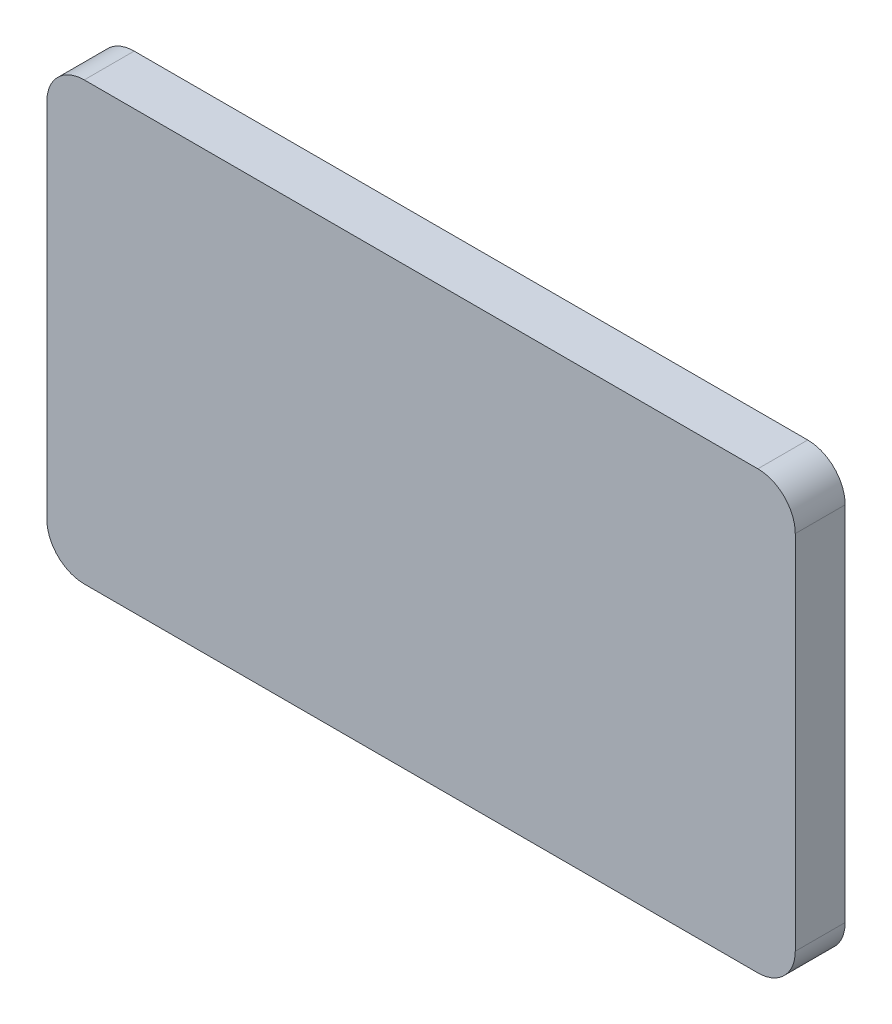
ISO-10303-21;
HEADER;
FILE_DESCRIPTION(('STEP AP214'),'2;1');
FILE_NAME('part.step','',(''),(''),'','','');
FILE_SCHEMA(('AUTOMOTIVE_DESIGN { 1 0 10303 214 1 1 1 1 }'));
ENDSEC;
DATA;
#1=APPLICATION_CONTEXT('core data for automotive mechanical design processes');
#2=APPLICATION_PROTOCOL_DEFINITION('international standard','automotive_design',2000,#1);
#3=PRODUCT_CONTEXT('',#1,'mechanical');
#4=PRODUCT('Part','Part','',(#3));
#5=PRODUCT_RELATED_PRODUCT_CATEGORY('part','',(#4));
#6=PRODUCT_DEFINITION_FORMATION('','',#4);
#7=PRODUCT_DEFINITION_CONTEXT('part definition',#1,'design');
#8=PRODUCT_DEFINITION('design','',#6,#7);
#9=PRODUCT_DEFINITION_SHAPE('','',#8);
#10=(LENGTH_UNIT() NAMED_UNIT(*) SI_UNIT(.MILLI.,.METRE.));
#11=(NAMED_UNIT(*) PLANE_ANGLE_UNIT() SI_UNIT($,.RADIAN.));
#12=(NAMED_UNIT(*) SI_UNIT($,.STERADIAN.) SOLID_ANGLE_UNIT());
#13=UNCERTAINTY_MEASURE_WITH_UNIT(LENGTH_MEASURE(1.E-05),#10,'distance_accuracy_value','');
#14=(GEOMETRIC_REPRESENTATION_CONTEXT(3) GLOBAL_UNCERTAINTY_ASSIGNED_CONTEXT((#13)) GLOBAL_UNIT_ASSIGNED_CONTEXT((#10,
#11,#12)) REPRESENTATION_CONTEXT('',''));
#15=CARTESIAN_POINT('',(0.,0.,0.));
#16=DIRECTION('',(0.,0.,1.));
#17=DIRECTION('',(1.,0.,0.));
#18=AXIS2_PLACEMENT_3D('',#15,#16,#17);
#19=CARTESIAN_POINT('',(0.,0.,12.7));
#20=DIRECTION('',(1.,0.,0.));
#21=DIRECTION('',(0.,0.,-1.));
#22=AXIS2_PLACEMENT_3D('',#19,#20,#21);
#23=PLANE('',#22);
#24=DIRECTION('',(0.,-1.,0.));
#25=VECTOR('',#24,1.);
#26=CARTESIAN_POINT('',(0.,0.,0.));
#27=LINE('',#26,#25);
#28=CARTESIAN_POINT('',(0.,101.6,0.));
#29=VERTEX_POINT('',#28);
#30=CARTESIAN_POINT('',(0.,9.525,0.));
#31=VERTEX_POINT('',#30);
#32=EDGE_CURVE('E125',#29,#31,#27,.T.);
#33=ORIENTED_EDGE('',*,*,#32,.T.);
#34=DIRECTION('',(0.,0.,-1.));
#35=VECTOR('',#34,1.);
#36=CARTESIAN_POINT('',(0.,9.525,12.7));
#37=LINE('',#36,#35);
#38=CARTESIAN_POINT('',(0.,9.525,12.7));
#39=VERTEX_POINT('',#38);
#40=EDGE_CURVE('E103',#31,#39,#37,.F.);
#41=ORIENTED_EDGE('',*,*,#40,.T.);
#42=DIRECTION('',(0.,-1.,0.));
#43=VECTOR('',#42,1.);
#44=CARTESIAN_POINT('',(0.,0.,12.7));
#45=LINE('',#44,#43);
#46=CARTESIAN_POINT('',(0.,101.6,12.7));
#47=VERTEX_POINT('',#46);
#48=EDGE_CURVE('E134',#47,#39,#45,.T.);
#49=ORIENTED_EDGE('',*,*,#48,.F.);
#50=DIRECTION('',(0.,0.,-1.));
#51=VECTOR('',#50,1.);
#52=CARTESIAN_POINT('',(0.,101.6,12.7));
#53=LINE('',#52,#51);
#54=EDGE_CURVE('E108',#47,#29,#53,.T.);
#55=ORIENTED_EDGE('',*,*,#54,.T.);
#56=EDGE_LOOP('',(#33,#41,#49,#55));
#57=FACE_BOUND('',#56,.T.);
#58=ADVANCED_FACE('F32',(#57),#23,.F.);
#59=CARTESIAN_POINT('',(0.,0.,12.7));
#60=DIRECTION('',(0.,1.,0.));
#61=DIRECTION('',(0.,0.,1.));
#62=AXIS2_PLACEMENT_3D('',#59,#60,#61);
#63=PLANE('',#62);
#64=DIRECTION('',(1.,0.,0.));
#65=VECTOR('',#64,1.);
#66=CARTESIAN_POINT('',(0.,0.,12.7));
#67=LINE('',#66,#65);
#68=CARTESIAN_POINT('',(9.525,0.,12.7));
#69=VERTEX_POINT('',#68);
#70=CARTESIAN_POINT('',(180.975,0.,12.7));
#71=VERTEX_POINT('',#70);
#72=EDGE_CURVE('E118',#69,#71,#67,.T.);
#73=ORIENTED_EDGE('',*,*,#72,.F.);
#74=DIRECTION('',(0.,0.,-1.));
#75=VECTOR('',#74,1.);
#76=CARTESIAN_POINT('',(9.525,0.,12.7));
#77=LINE('',#76,#75);
#78=CARTESIAN_POINT('',(9.525,0.,0.));
#79=VERTEX_POINT('',#78);
#80=EDGE_CURVE('E102',#69,#79,#77,.T.);
#81=ORIENTED_EDGE('',*,*,#80,.T.);
#82=DIRECTION('',(1.,0.,0.));
#83=VECTOR('',#82,1.);
#84=CARTESIAN_POINT('',(0.,0.,0.));
#85=LINE('',#84,#83);
#86=CARTESIAN_POINT('',(180.975,0.,0.));
#87=VERTEX_POINT('',#86);
#88=EDGE_CURVE('E115',#79,#87,#85,.T.);
#89=ORIENTED_EDGE('',*,*,#88,.T.);
#90=DIRECTION('',(0.,0.,-1.));
#91=VECTOR('',#90,1.);
#92=CARTESIAN_POINT('',(180.975,0.,12.7));
#93=LINE('',#92,#91);
#94=EDGE_CURVE('E120',#87,#71,#93,.F.);
#95=ORIENTED_EDGE('',*,*,#94,.T.);
#96=EDGE_LOOP('',(#73,#81,#89,#95));
#97=FACE_BOUND('',#96,.T.);
#98=ADVANCED_FACE('F114',(#97),#63,.F.);
#99=CARTESIAN_POINT('',(190.5,0.,12.7));
#100=DIRECTION('',(-1.,0.,0.));
#101=DIRECTION('',(0.,0.,1.));
#102=AXIS2_PLACEMENT_3D('',#99,#100,#101);
#103=PLANE('',#102);
#104=DIRECTION('',(0.,1.,0.));
#105=VECTOR('',#104,1.);
#106=CARTESIAN_POINT('',(190.5,0.,12.7));
#107=LINE('',#106,#105);
#108=CARTESIAN_POINT('',(190.5,9.525,12.7));
#109=VERTEX_POINT('',#108);
#110=CARTESIAN_POINT('',(190.5,101.6,12.7));
#111=VERTEX_POINT('',#110);
#112=EDGE_CURVE('E160',#109,#111,#107,.T.);
#113=ORIENTED_EDGE('',*,*,#112,.F.);
#114=DIRECTION('',(0.,0.,-1.));
#115=VECTOR('',#114,1.);
#116=CARTESIAN_POINT('',(190.5,9.525,12.7));
#117=LINE('',#116,#115);
#118=CARTESIAN_POINT('',(190.5,9.525,0.));
#119=VERTEX_POINT('',#118);
#120=EDGE_CURVE('E153',#109,#119,#117,.T.);
#121=ORIENTED_EDGE('',*,*,#120,.T.);
#122=DIRECTION('',(0.,1.,0.));
#123=VECTOR('',#122,1.);
#124=CARTESIAN_POINT('',(190.5,0.,0.));
#125=LINE('',#124,#123);
#126=CARTESIAN_POINT('',(190.5,101.6,0.));
#127=VERTEX_POINT('',#126);
#128=EDGE_CURVE('E124',#119,#127,#125,.T.);
#129=ORIENTED_EDGE('',*,*,#128,.T.);
#130=DIRECTION('',(0.,0.,-1.));
#131=VECTOR('',#130,1.);
#132=CARTESIAN_POINT('',(190.5,101.6,12.7));
#133=LINE('',#132,#131);
#134=EDGE_CURVE('E151',#127,#111,#133,.F.);
#135=ORIENTED_EDGE('',*,*,#134,.T.);
#136=EDGE_LOOP('',(#113,#121,#129,#135));
#137=FACE_BOUND('',#136,.T.);
#138=ADVANCED_FACE('F158',(#137),#103,.F.);
#139=CARTESIAN_POINT('',(0.,111.125,12.7));
#140=DIRECTION('',(0.,-1.,0.));
#141=DIRECTION('',(0.,0.,-1.));
#142=AXIS2_PLACEMENT_3D('',#139,#140,#141);
#143=PLANE('',#142);
#144=DIRECTION('',(-1.,0.,0.));
#145=VECTOR('',#144,1.);
#146=CARTESIAN_POINT('',(0.,111.125,12.7));
#147=LINE('',#146,#145);
#148=CARTESIAN_POINT('',(180.975,111.125,12.7));
#149=VERTEX_POINT('',#148);
#150=CARTESIAN_POINT('',(9.525,111.125,12.7));
#151=VERTEX_POINT('',#150);
#152=EDGE_CURVE('E135',#149,#151,#147,.T.);
#153=ORIENTED_EDGE('',*,*,#152,.F.);
#154=DIRECTION('',(0.,0.,-1.));
#155=VECTOR('',#154,1.);
#156=CARTESIAN_POINT('',(180.975,111.125,12.7));
#157=LINE('',#156,#155);
#158=CARTESIAN_POINT('',(180.975,111.125,0.));
#159=VERTEX_POINT('',#158);
#160=EDGE_CURVE('E11',#149,#159,#157,.T.);
#161=ORIENTED_EDGE('',*,*,#160,.T.);
#162=DIRECTION('',(-1.,0.,0.));
#163=VECTOR('',#162,1.);
#164=CARTESIAN_POINT('',(0.,111.125,0.));
#165=LINE('',#164,#163);
#166=CARTESIAN_POINT('',(9.525,111.125,0.));
#167=VERTEX_POINT('',#166);
#168=EDGE_CURVE('E128',#159,#167,#165,.T.);
#169=ORIENTED_EDGE('',*,*,#168,.T.);
#170=DIRECTION('',(0.,0.,-1.));
#171=VECTOR('',#170,1.);
#172=CARTESIAN_POINT('',(9.525,111.125,12.7));
#173=LINE('',#172,#171);
#174=EDGE_CURVE('E40',#167,#151,#173,.F.);
#175=ORIENTED_EDGE('',*,*,#174,.T.);
#176=EDGE_LOOP('',(#153,#161,#169,#175));
#177=FACE_BOUND('',#176,.T.);
#178=ADVANCED_FACE('F167',(#177),#143,.F.);
#179=CARTESIAN_POINT('',(0.,0.,12.7));
#180=DIRECTION('',(0.,0.,-1.));
#181=DIRECTION('',(-1.,0.,0.));
#182=AXIS2_PLACEMENT_3D('',#179,#180,#181);
#183=PLANE('',#182);
#184=ORIENTED_EDGE('',*,*,#48,.T.);
#185=CARTESIAN_POINT('',(9.525,9.525,12.7));
#186=DIRECTION('',(0.,0.,-1.));
#187=DIRECTION('',(-1.,0.,0.));
#188=AXIS2_PLACEMENT_3D('',#185,#186,#187);
#189=CIRCLE('',#188,9.525);
#190=EDGE_CURVE('E149',#39,#69,#189,.F.);
#191=ORIENTED_EDGE('',*,*,#190,.T.);
#192=ORIENTED_EDGE('',*,*,#72,.T.);
#193=CARTESIAN_POINT('',(180.975,9.525,12.7));
#194=DIRECTION('',(0.,0.,-1.));
#195=DIRECTION('',(-1.,0.,0.));
#196=AXIS2_PLACEMENT_3D('',#193,#194,#195);
#197=CIRCLE('',#196,9.525);
#198=EDGE_CURVE('E147',#71,#109,#197,.F.);
#199=ORIENTED_EDGE('',*,*,#198,.T.);
#200=ORIENTED_EDGE('',*,*,#112,.T.);
#201=CARTESIAN_POINT('',(180.975,101.6,12.7));
#202=DIRECTION('',(0.,0.,-1.));
#203=DIRECTION('',(-1.,0.,0.));
#204=AXIS2_PLACEMENT_3D('',#201,#202,#203);
#205=CIRCLE('',#204,9.525);
#206=EDGE_CURVE('E53',#111,#149,#205,.F.);
#207=ORIENTED_EDGE('',*,*,#206,.T.);
#208=ORIENTED_EDGE('',*,*,#152,.T.);
#209=CARTESIAN_POINT('',(9.525,101.6,12.7));
#210=DIRECTION('',(0.,0.,-1.));
#211=DIRECTION('',(-1.,0.,0.));
#212=AXIS2_PLACEMENT_3D('',#209,#210,#211);
#213=CIRCLE('',#212,9.525);
#214=EDGE_CURVE('E144',#151,#47,#213,.F.);
#215=ORIENTED_EDGE('',*,*,#214,.T.);
#216=EDGE_LOOP('',(#184,#191,#192,#199,#200,#207,#208,#215));
#217=FACE_BOUND('',#216,.T.);
#218=ADVANCED_FACE('F174',(#217),#183,.F.);
#219=CARTESIAN_POINT('',(0.,0.,0.));
#220=DIRECTION('',(0.,0.,-1.));
#221=DIRECTION('',(-1.,0.,0.));
#222=AXIS2_PLACEMENT_3D('',#219,#220,#221);
#223=PLANE('',#222);
#224=ORIENTED_EDGE('',*,*,#88,.F.);
#225=CARTESIAN_POINT('',(9.525,9.525,0.));
#226=DIRECTION('',(0.,0.,-1.));
#227=DIRECTION('',(-1.,0.,0.));
#228=AXIS2_PLACEMENT_3D('',#225,#226,#227);
#229=CIRCLE('',#228,9.525);
#230=EDGE_CURVE('E98',#79,#31,#229,.T.);
#231=ORIENTED_EDGE('',*,*,#230,.T.);
#232=ORIENTED_EDGE('',*,*,#32,.F.);
#233=CARTESIAN_POINT('',(9.525,101.6,0.));
#234=DIRECTION('',(0.,0.,-1.));
#235=DIRECTION('',(-1.,0.,0.));
#236=AXIS2_PLACEMENT_3D('',#233,#234,#235);
#237=CIRCLE('',#236,9.525);
#238=EDGE_CURVE('E119',#29,#167,#237,.T.);
#239=ORIENTED_EDGE('',*,*,#238,.T.);
#240=ORIENTED_EDGE('',*,*,#168,.F.);
#241=CARTESIAN_POINT('',(180.975,101.6,0.));
#242=DIRECTION('',(0.,0.,-1.));
#243=DIRECTION('',(-1.,0.,0.));
#244=AXIS2_PLACEMENT_3D('',#241,#242,#243);
#245=CIRCLE('',#244,9.525);
#246=EDGE_CURVE('E138',#159,#127,#245,.T.);
#247=ORIENTED_EDGE('',*,*,#246,.T.);
#248=ORIENTED_EDGE('',*,*,#128,.F.);
#249=CARTESIAN_POINT('',(180.975,9.525,0.));
#250=DIRECTION('',(0.,0.,-1.));
#251=DIRECTION('',(-1.,0.,0.));
#252=AXIS2_PLACEMENT_3D('',#249,#250,#251);
#253=CIRCLE('',#252,9.525);
#254=EDGE_CURVE('E109',#119,#87,#253,.T.);
#255=ORIENTED_EDGE('',*,*,#254,.T.);
#256=EDGE_LOOP('',(#224,#231,#232,#239,#240,#247,#248,#255));
#257=FACE_BOUND('',#256,.T.);
#258=ADVANCED_FACE('F122',(#257),#223,.T.);
#259=CARTESIAN_POINT('',(9.525,9.525,12.7));
#260=DIRECTION('',(0.,0.,-1.));
#261=DIRECTION('',(-1.,0.,0.));
#262=AXIS2_PLACEMENT_3D('',#259,#260,#261);
#263=CYLINDRICAL_SURFACE('',#262,9.525);
#264=ORIENTED_EDGE('',*,*,#190,.F.);
#265=ORIENTED_EDGE('',*,*,#40,.F.);
#266=ORIENTED_EDGE('',*,*,#230,.F.);
#267=ORIENTED_EDGE('',*,*,#80,.F.);
#268=EDGE_LOOP('',(#264,#265,#266,#267));
#269=FACE_BOUND('',#268,.T.);
#270=ADVANCED_FACE('F101',(#269),#263,.T.);
#271=CARTESIAN_POINT('',(180.975,9.525,12.7));
#272=DIRECTION('',(0.,0.,-1.));
#273=DIRECTION('',(-1.,0.,0.));
#274=AXIS2_PLACEMENT_3D('',#271,#272,#273);
#275=CYLINDRICAL_SURFACE('',#274,9.525);
#276=ORIENTED_EDGE('',*,*,#198,.F.);
#277=ORIENTED_EDGE('',*,*,#94,.F.);
#278=ORIENTED_EDGE('',*,*,#254,.F.);
#279=ORIENTED_EDGE('',*,*,#120,.F.);
#280=EDGE_LOOP('',(#276,#277,#278,#279));
#281=FACE_BOUND('',#280,.T.);
#282=ADVANCED_FACE('F182',(#281),#275,.T.);
#283=CARTESIAN_POINT('',(180.975,101.6,12.7));
#284=DIRECTION('',(0.,0.,-1.));
#285=DIRECTION('',(-1.,0.,0.));
#286=AXIS2_PLACEMENT_3D('',#283,#284,#285);
#287=CYLINDRICAL_SURFACE('',#286,9.525);
#288=ORIENTED_EDGE('',*,*,#206,.F.);
#289=ORIENTED_EDGE('',*,*,#134,.F.);
#290=ORIENTED_EDGE('',*,*,#246,.F.);
#291=ORIENTED_EDGE('',*,*,#160,.F.);
#292=EDGE_LOOP('',(#288,#289,#290,#291));
#293=FACE_BOUND('',#292,.T.);
#294=ADVANCED_FACE('F166',(#293),#287,.T.);
#295=CARTESIAN_POINT('',(9.525,101.6,12.7));
#296=DIRECTION('',(0.,0.,-1.));
#297=DIRECTION('',(-1.,0.,0.));
#298=AXIS2_PLACEMENT_3D('',#295,#296,#297);
#299=CYLINDRICAL_SURFACE('',#298,9.525);
#300=ORIENTED_EDGE('',*,*,#214,.F.);
#301=ORIENTED_EDGE('',*,*,#174,.F.);
#302=ORIENTED_EDGE('',*,*,#238,.F.);
#303=ORIENTED_EDGE('',*,*,#54,.F.);
#304=EDGE_LOOP('',(#300,#301,#302,#303));
#305=FACE_BOUND('',#304,.T.);
#306=ADVANCED_FACE('F34',(#305),#299,.T.);
#307=CLOSED_SHELL('',(#58,#98,#138,#178,#218,#258,#270,#282,#294,#306));
#308=MANIFOLD_SOLID_BREP('B2',#307);
#309=ADVANCED_BREP_SHAPE_REPRESENTATION('',(#18,#308),#14);
#310=SHAPE_DEFINITION_REPRESENTATION(#9,#309);
ENDSEC;
END-ISO-10303-21;
